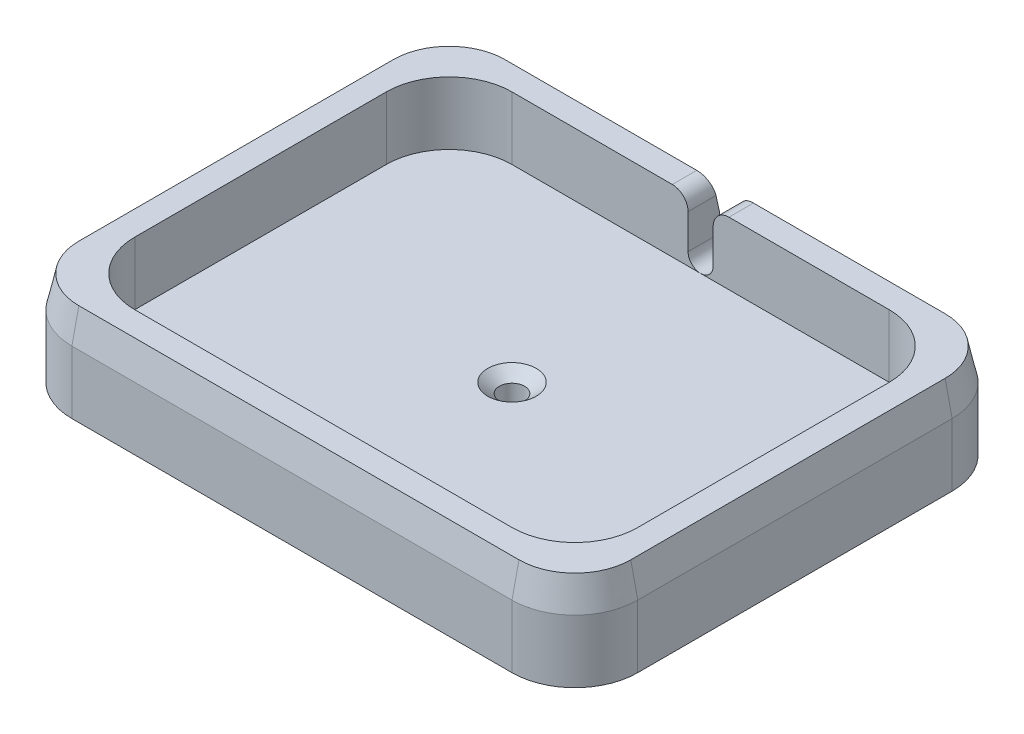
ISO-10303-21;
HEADER;
FILE_DESCRIPTION(('STEP AP214'),'2;1');
FILE_NAME('part.step','',(''),(''),'','','');
FILE_SCHEMA(('AUTOMOTIVE_DESIGN { 1 0 10303 214 1 1 1 1 }'));
ENDSEC;
DATA;
#1=APPLICATION_CONTEXT('core data for automotive mechanical design processes');
#2=APPLICATION_PROTOCOL_DEFINITION('international standard','automotive_design',2000,#1);
#3=PRODUCT_CONTEXT('',#1,'mechanical');
#4=PRODUCT('Part','Part','',(#3));
#5=PRODUCT_RELATED_PRODUCT_CATEGORY('part','',(#4));
#6=PRODUCT_DEFINITION_FORMATION('','',#4);
#7=PRODUCT_DEFINITION_CONTEXT('part definition',#1,'design');
#8=PRODUCT_DEFINITION('design','',#6,#7);
#9=PRODUCT_DEFINITION_SHAPE('','',#8);
#10=(LENGTH_UNIT() NAMED_UNIT(*) SI_UNIT(.MILLI.,.METRE.));
#11=(NAMED_UNIT(*) PLANE_ANGLE_UNIT() SI_UNIT($,.RADIAN.));
#12=(NAMED_UNIT(*) SI_UNIT($,.STERADIAN.) SOLID_ANGLE_UNIT());
#13=UNCERTAINTY_MEASURE_WITH_UNIT(LENGTH_MEASURE(1.E-05),#10,'distance_accuracy_value','');
#14=(GEOMETRIC_REPRESENTATION_CONTEXT(3) GLOBAL_UNCERTAINTY_ASSIGNED_CONTEXT((#13)) GLOBAL_UNIT_ASSIGNED_CONTEXT((#10,
#11,#12)) REPRESENTATION_CONTEXT('',''));
#15=CARTESIAN_POINT('',(0.,0.,0.));
#16=DIRECTION('',(0.,0.,1.));
#17=DIRECTION('',(1.,0.,0.));
#18=AXIS2_PLACEMENT_3D('',#15,#16,#17);
#19=CARTESIAN_POINT('',(0.,0.,0.));
#20=DIRECTION('',(0.,-1.,0.));
#21=DIRECTION('',(0.,0.,-1.));
#22=AXIS2_PLACEMENT_3D('',#19,#20,#21);
#23=PLANE('',#22);
#24=DIRECTION('',(-1.,0.,0.));
#25=VECTOR('',#24,1.);
#26=CARTESIAN_POINT('',(-50.8,0.,-38.1));
#27=LINE('',#26,#25);
#28=CARTESIAN_POINT('',(38.1,0.,-38.1));
#29=VERTEX_POINT('',#28);
#30=CARTESIAN_POINT('',(0.,0.,-38.1));
#31=VERTEX_POINT('',#30);
#32=EDGE_CURVE('E281',#29,#31,#27,.T.);
#33=ORIENTED_EDGE('',*,*,#32,.T.);
#34=CARTESIAN_POINT('',(-38.1,0.,-38.1));
#35=VERTEX_POINT('',#34);
#36=EDGE_CURVE('E280',#31,#35,#27,.T.);
#37=ORIENTED_EDGE('',*,*,#36,.T.);
#38=CARTESIAN_POINT('',(-38.1,0.,-25.4));
#39=DIRECTION('',(0.,-1.,0.));
#40=DIRECTION('',(0.,0.,-1.));
#41=AXIS2_PLACEMENT_3D('',#38,#39,#40);
#42=CIRCLE('',#41,12.7);
#43=CARTESIAN_POINT('',(-50.8,0.,-25.4));
#44=VERTEX_POINT('',#43);
#45=EDGE_CURVE('E299',#35,#44,#42,.F.);
#46=ORIENTED_EDGE('',*,*,#45,.T.);
#47=DIRECTION('',(0.,0.,1.));
#48=VECTOR('',#47,1.);
#49=CARTESIAN_POINT('',(-50.8,0.,38.1));
#50=LINE('',#49,#48);
#51=CARTESIAN_POINT('',(-50.8,0.,25.4));
#52=VERTEX_POINT('',#51);
#53=EDGE_CURVE('E284',#44,#52,#50,.T.);
#54=ORIENTED_EDGE('',*,*,#53,.T.);
#55=CARTESIAN_POINT('',(-38.1,0.,25.4));
#56=DIRECTION('',(0.,-1.,0.));
#57=DIRECTION('',(0.,0.,-1.));
#58=AXIS2_PLACEMENT_3D('',#55,#56,#57);
#59=CIRCLE('',#58,12.7);
#60=CARTESIAN_POINT('',(-38.1,0.,38.1));
#61=VERTEX_POINT('',#60);
#62=EDGE_CURVE('E297',#52,#61,#59,.F.);
#63=ORIENTED_EDGE('',*,*,#62,.T.);
#64=DIRECTION('',(1.,0.,0.));
#65=VECTOR('',#64,1.);
#66=CARTESIAN_POINT('',(-50.8,0.,38.1));
#67=LINE('',#66,#65);
#68=CARTESIAN_POINT('',(38.1,0.,38.1));
#69=VERTEX_POINT('',#68);
#70=EDGE_CURVE('E268',#61,#69,#67,.T.);
#71=ORIENTED_EDGE('',*,*,#70,.T.);
#72=CARTESIAN_POINT('',(38.1,0.,25.4));
#73=DIRECTION('',(0.,-1.,0.));
#74=DIRECTION('',(0.,0.,-1.));
#75=AXIS2_PLACEMENT_3D('',#72,#73,#74);
#76=CIRCLE('',#75,12.7);
#77=CARTESIAN_POINT('',(50.8,0.,25.4));
#78=VERTEX_POINT('',#77);
#79=EDGE_CURVE('E295',#69,#78,#76,.F.);
#80=ORIENTED_EDGE('',*,*,#79,.T.);
#81=DIRECTION('',(0.,0.,-1.));
#82=VECTOR('',#81,1.);
#83=CARTESIAN_POINT('',(50.8,0.,38.1));
#84=LINE('',#83,#82);
#85=CARTESIAN_POINT('',(50.8,0.,-25.4));
#86=VERTEX_POINT('',#85);
#87=EDGE_CURVE('E263',#78,#86,#84,.T.);
#88=ORIENTED_EDGE('',*,*,#87,.T.);
#89=CARTESIAN_POINT('',(38.1,0.,-25.4));
#90=DIRECTION('',(0.,-1.,0.));
#91=DIRECTION('',(0.,0.,-1.));
#92=AXIS2_PLACEMENT_3D('',#89,#90,#91);
#93=CIRCLE('',#92,12.7);
#94=EDGE_CURVE('E293',#86,#29,#93,.F.);
#95=ORIENTED_EDGE('',*,*,#94,.T.);
#96=EDGE_LOOP('',(#33,#37,#46,#54,#63,#71,#80,#88,#95));
#97=FACE_BOUND('',#96,.T.);
#98=CARTESIAN_POINT('',(0.,0.,0.));
#99=DIRECTION('',(0.,1.,0.));
#100=DIRECTION('',(0.,0.,1.));
#101=AXIS2_PLACEMENT_3D('',#98,#99,#100);
#102=CIRCLE('',#101,4.8895);
#103=CARTESIAN_POINT('',(0.,0.,4.8895));
#104=VERTEX_POINT('',#103);
#105=EDGE_CURVE('E428',#104,#104,#102,.T.);
#106=ORIENTED_EDGE('',*,*,#105,.F.);
#107=EDGE_LOOP('',(#106));
#108=FACE_BOUND('',#107,.T.);
#109=ADVANCED_FACE('F32',(#97,#108),#23,.F.);
#110=CARTESIAN_POINT('',(-50.8,12.7,-38.1));
#111=DIRECTION('',(0.,0.,1.));
#112=DIRECTION('',(1.,0.,0.));
#113=AXIS2_PLACEMENT_3D('',#110,#111,#112);
#114=PLANE('',#113);
#115=DIRECTION('',(-1.,0.,0.));
#116=VECTOR('',#115,1.);
#117=CARTESIAN_POINT('',(-50.8,12.7,-38.1));
#118=LINE('',#117,#116);
#119=CARTESIAN_POINT('',(38.1,12.7,-38.1));
#120=VERTEX_POINT('',#119);
#121=CARTESIAN_POINT('',(5.715,12.7,-38.1));
#122=VERTEX_POINT('',#121);
#123=EDGE_CURVE('E269',#120,#122,#118,.T.);
#124=ORIENTED_EDGE('',*,*,#123,.T.);
#125=CARTESIAN_POINT('',(5.715,9.525,-38.1));
#126=DIRECTION('',(0.,0.,1.));
#127=DIRECTION('',(1.,0.,0.));
#128=AXIS2_PLACEMENT_3D('',#125,#126,#127);
#129=CIRCLE('',#128,3.175);
#130=CARTESIAN_POINT('',(2.54,9.525,-38.1));
#131=VERTEX_POINT('',#130);
#132=EDGE_CURVE('E223',#122,#131,#129,.T.);
#133=ORIENTED_EDGE('',*,*,#132,.T.);
#134=DIRECTION('',(0.,-1.,0.));
#135=VECTOR('',#134,1.);
#136=CARTESIAN_POINT('',(2.54,22.86,-38.1));
#137=LINE('',#136,#135);
#138=CARTESIAN_POINT('',(2.54,2.54,-38.1));
#139=VERTEX_POINT('',#138);
#140=EDGE_CURVE('E215',#131,#139,#137,.T.);
#141=ORIENTED_EDGE('',*,*,#140,.T.);
#142=CARTESIAN_POINT('',(0.,2.54,-38.1));
#143=DIRECTION('',(0.,0.,1.));
#144=DIRECTION('',(1.,0.,0.));
#145=AXIS2_PLACEMENT_3D('',#142,#143,#144);
#146=CIRCLE('',#145,2.54);
#147=EDGE_CURVE('E220',#139,#31,#146,.F.);
#148=ORIENTED_EDGE('',*,*,#147,.T.);
#149=ORIENTED_EDGE('',*,*,#32,.F.);
#150=DIRECTION('',(0.,-1.,0.));
#151=VECTOR('',#150,1.);
#152=CARTESIAN_POINT('',(38.1,12.7,-38.1));
#153=LINE('',#152,#151);
#154=EDGE_CURVE('E277',#29,#120,#153,.F.);
#155=ORIENTED_EDGE('',*,*,#154,.T.);
#156=EDGE_LOOP('',(#124,#133,#141,#148,#149,#155));
#157=FACE_BOUND('',#156,.T.);
#158=ADVANCED_FACE('F218',(#157),#114,.T.);
#159=CARTESIAN_POINT('',(0.,12.7,0.));
#160=DIRECTION('',(0.,1.,0.));
#161=DIRECTION('',(0.,0.,1.));
#162=AXIS2_PLACEMENT_3D('',#159,#160,#161);
#163=PLANE('',#162);
#164=DIRECTION('',(0.,0.,-1.));
#165=VECTOR('',#164,1.);
#166=CARTESIAN_POINT('',(-5.715,12.7,-44.45));
#167=LINE('',#166,#165);
#168=CARTESIAN_POINT('',(-5.71500000000001,12.7,-38.1));
#169=VERTEX_POINT('',#168);
#170=CARTESIAN_POINT('',(-5.715,12.7,-43.0422388922173));
#171=VERTEX_POINT('',#170);
#172=EDGE_CURVE('E354',#169,#171,#167,.T.);
#173=ORIENTED_EDGE('',*,*,#172,.T.);
#174=DIRECTION('',(-1.,0.,0.));
#175=VECTOR('',#174,1.);
#176=CARTESIAN_POINT('',(-44.45,12.7,-43.0422388922173));
#177=LINE('',#176,#175);
#178=CARTESIAN_POINT('',(-44.45,12.7,-43.0422388922173));
#179=VERTEX_POINT('',#178);
#180=EDGE_CURVE('E381',#171,#179,#177,.T.);
#181=ORIENTED_EDGE('',*,*,#180,.T.);
#182=CARTESIAN_POINT('',(-44.45,12.7,-31.75));
#183=DIRECTION('',(0.,1.,0.));
#184=DIRECTION('',(0.,0.,1.));
#185=AXIS2_PLACEMENT_3D('',#182,#183,#184);
#186=CIRCLE('',#185,11.2922388922173);
#187=CARTESIAN_POINT('',(-55.7422388922173,12.7,-31.75));
#188=VERTEX_POINT('',#187);
#189=EDGE_CURVE('E379',#179,#188,#186,.T.);
#190=ORIENTED_EDGE('',*,*,#189,.T.);
#191=DIRECTION('',(0.,0.,1.));
#192=VECTOR('',#191,1.);
#193=CARTESIAN_POINT('',(-55.7422388922173,12.7,31.75));
#194=LINE('',#193,#192);
#195=CARTESIAN_POINT('',(-55.7422388922173,12.7,31.75));
#196=VERTEX_POINT('',#195);
#197=EDGE_CURVE('E376',#188,#196,#194,.T.);
#198=ORIENTED_EDGE('',*,*,#197,.T.);
#199=CARTESIAN_POINT('',(-44.45,12.7,31.75));
#200=DIRECTION('',(0.,1.,0.));
#201=DIRECTION('',(0.,0.,1.));
#202=AXIS2_PLACEMENT_3D('',#199,#200,#201);
#203=CIRCLE('',#202,11.2922388922173);
#204=CARTESIAN_POINT('',(-44.45,12.7,43.0422388922173));
#205=VERTEX_POINT('',#204);
#206=EDGE_CURVE('E372',#196,#205,#203,.T.);
#207=ORIENTED_EDGE('',*,*,#206,.T.);
#208=DIRECTION('',(1.,0.,0.));
#209=VECTOR('',#208,1.);
#210=CARTESIAN_POINT('',(44.45,12.7,43.0422388922173));
#211=LINE('',#210,#209);
#212=CARTESIAN_POINT('',(44.45,12.7,43.0422388922173));
#213=VERTEX_POINT('',#212);
#214=EDGE_CURVE('E370',#205,#213,#211,.T.);
#215=ORIENTED_EDGE('',*,*,#214,.T.);
#216=CARTESIAN_POINT('',(44.45,12.7,31.75));
#217=DIRECTION('',(0.,1.,0.));
#218=DIRECTION('',(0.,0.,1.));
#219=AXIS2_PLACEMENT_3D('',#216,#217,#218);
#220=CIRCLE('',#219,11.2922388922173);
#221=CARTESIAN_POINT('',(55.7422388922173,12.7,31.75));
#222=VERTEX_POINT('',#221);
#223=EDGE_CURVE('E368',#213,#222,#220,.T.);
#224=ORIENTED_EDGE('',*,*,#223,.T.);
#225=DIRECTION('',(0.,0.,-1.));
#226=VECTOR('',#225,1.);
#227=CARTESIAN_POINT('',(55.7422388922173,12.7,-31.75));
#228=LINE('',#227,#226);
#229=CARTESIAN_POINT('',(55.7422388922173,12.7,-31.75));
#230=VERTEX_POINT('',#229);
#231=EDGE_CURVE('E364',#222,#230,#228,.T.);
#232=ORIENTED_EDGE('',*,*,#231,.T.);
#233=CARTESIAN_POINT('',(44.45,12.7,-31.75));
#234=DIRECTION('',(0.,1.,0.));
#235=DIRECTION('',(0.,0.,1.));
#236=AXIS2_PLACEMENT_3D('',#233,#234,#235);
#237=CIRCLE('',#236,11.2922388922173);
#238=CARTESIAN_POINT('',(44.45,12.7,-43.0422388922173));
#239=VERTEX_POINT('',#238);
#240=EDGE_CURVE('E366',#230,#239,#237,.T.);
#241=ORIENTED_EDGE('',*,*,#240,.T.);
#242=DIRECTION('',(-1.,0.,0.));
#243=VECTOR('',#242,1.);
#244=CARTESIAN_POINT('',(5.71499999999999,12.7,-43.0422388922173));
#245=LINE('',#244,#243);
#246=CARTESIAN_POINT('',(5.715,12.7,-43.0422388922173));
#247=VERTEX_POINT('',#246);
#248=EDGE_CURVE('E374',#239,#247,#245,.T.);
#249=ORIENTED_EDGE('',*,*,#248,.T.);
#250=DIRECTION('',(0.,0.,1.));
#251=VECTOR('',#250,1.);
#252=CARTESIAN_POINT('',(5.715,12.7,-38.1));
#253=LINE('',#252,#251);
#254=EDGE_CURVE('E352',#247,#122,#253,.T.);
#255=ORIENTED_EDGE('',*,*,#254,.T.);
#256=ORIENTED_EDGE('',*,*,#123,.F.);
#257=CARTESIAN_POINT('',(38.1,12.7,-25.4));
#258=DIRECTION('',(0.,1.,0.));
#259=DIRECTION('',(0.,0.,1.));
#260=AXIS2_PLACEMENT_3D('',#257,#258,#259);
#261=CIRCLE('',#260,12.7);
#262=CARTESIAN_POINT('',(50.8,12.7,-25.4));
#263=VERTEX_POINT('',#262);
#264=EDGE_CURVE('E350',#120,#263,#261,.F.);
#265=ORIENTED_EDGE('',*,*,#264,.T.);
#266=DIRECTION('',(0.,0.,-1.));
#267=VECTOR('',#266,1.);
#268=CARTESIAN_POINT('',(50.8,12.7,38.1));
#269=LINE('',#268,#267);
#270=CARTESIAN_POINT('',(50.8,12.7,25.4));
#271=VERTEX_POINT('',#270);
#272=EDGE_CURVE('E264',#271,#263,#269,.T.);
#273=ORIENTED_EDGE('',*,*,#272,.F.);
#274=CARTESIAN_POINT('',(38.1,12.7,25.4));
#275=DIRECTION('',(0.,1.,0.));
#276=DIRECTION('',(0.,0.,1.));
#277=AXIS2_PLACEMENT_3D('',#274,#275,#276);
#278=CIRCLE('',#277,12.7);
#279=CARTESIAN_POINT('',(38.1,12.7,38.1));
#280=VERTEX_POINT('',#279);
#281=EDGE_CURVE('E348',#271,#280,#278,.F.);
#282=ORIENTED_EDGE('',*,*,#281,.T.);
#283=DIRECTION('',(1.,0.,0.));
#284=VECTOR('',#283,1.);
#285=CARTESIAN_POINT('',(-50.8,12.7,38.1));
#286=LINE('',#285,#284);
#287=CARTESIAN_POINT('',(-38.1,12.7,38.1));
#288=VERTEX_POINT('',#287);
#289=EDGE_CURVE('E274',#288,#280,#286,.T.);
#290=ORIENTED_EDGE('',*,*,#289,.F.);
#291=CARTESIAN_POINT('',(-38.1,12.7,25.4));
#292=DIRECTION('',(0.,1.,0.));
#293=DIRECTION('',(0.,0.,1.));
#294=AXIS2_PLACEMENT_3D('',#291,#292,#293);
#295=CIRCLE('',#294,12.7);
#296=CARTESIAN_POINT('',(-50.8,12.7,25.4));
#297=VERTEX_POINT('',#296);
#298=EDGE_CURVE('E346',#288,#297,#295,.F.);
#299=ORIENTED_EDGE('',*,*,#298,.T.);
#300=DIRECTION('',(0.,0.,1.));
#301=VECTOR('',#300,1.);
#302=CARTESIAN_POINT('',(-50.8,12.7,38.1));
#303=LINE('',#302,#301);
#304=CARTESIAN_POINT('',(-50.8,12.7,-25.4));
#305=VERTEX_POINT('',#304);
#306=EDGE_CURVE('E271',#305,#297,#303,.T.);
#307=ORIENTED_EDGE('',*,*,#306,.F.);
#308=CARTESIAN_POINT('',(-38.1,12.7,-25.4));
#309=DIRECTION('',(0.,1.,0.));
#310=DIRECTION('',(0.,0.,1.));
#311=AXIS2_PLACEMENT_3D('',#308,#309,#310);
#312=CIRCLE('',#311,12.7);
#313=CARTESIAN_POINT('',(-38.1,12.7,-38.1));
#314=VERTEX_POINT('',#313);
#315=EDGE_CURVE('E343',#305,#314,#312,.F.);
#316=ORIENTED_EDGE('',*,*,#315,.T.);
#317=EDGE_CURVE('E267',#169,#314,#118,.T.);
#318=ORIENTED_EDGE('',*,*,#317,.F.);
#319=EDGE_LOOP('',(#173,#181,#190,#198,#207,#215,#224,#232,#241,#249,#255,#256,#265,#273,#282,
#290,#299,#307,#316,#318));
#320=FACE_BOUND('',#319,.T.);
#321=ADVANCED_FACE('F465',(#320),#163,.T.);
#322=CARTESIAN_POINT('',(-57.15,12.7,44.45));
#323=DIRECTION('',(0.,0.,-1.));
#324=DIRECTION('',(-1.,0.,0.));
#325=AXIS2_PLACEMENT_3D('',#322,#323,#324);
#326=PLANE('',#325);
#327=DIRECTION('',(0.,-1.,0.));
#328=VECTOR('',#327,1.);
#329=CARTESIAN_POINT('',(44.45,12.7,44.45));
#330=LINE('',#329,#328);
#331=CARTESIAN_POINT('',(44.45,-6.35,44.45));
#332=VERTEX_POINT('',#331);
#333=CARTESIAN_POINT('',(44.45,6.34999999999992,44.45));
#334=VERTEX_POINT('',#333);
#335=EDGE_CURVE('E330',#332,#334,#330,.F.);
#336=ORIENTED_EDGE('',*,*,#335,.T.);
#337=DIRECTION('',(-1.,0.,0.));
#338=VECTOR('',#337,1.);
#339=CARTESIAN_POINT('',(-44.45,6.34999999999992,44.45));
#340=LINE('',#339,#338);
#341=CARTESIAN_POINT('',(-44.45,6.34999999999992,44.45));
#342=VERTEX_POINT('',#341);
#343=EDGE_CURVE('E401',#334,#342,#340,.T.);
#344=ORIENTED_EDGE('',*,*,#343,.T.);
#345=DIRECTION('',(0.,-1.,0.));
#346=VECTOR('',#345,1.);
#347=CARTESIAN_POINT('',(-44.45,12.7,44.45));
#348=LINE('',#347,#346);
#349=CARTESIAN_POINT('',(-44.45,-6.35,44.45));
#350=VERTEX_POINT('',#349);
#351=EDGE_CURVE('E328',#342,#350,#348,.T.);
#352=ORIENTED_EDGE('',*,*,#351,.T.);
#353=DIRECTION('',(-1.,0.,0.));
#354=VECTOR('',#353,1.);
#355=CARTESIAN_POINT('',(-57.15,-6.35,44.45));
#356=LINE('',#355,#354);
#357=EDGE_CURVE('E260',#332,#350,#356,.T.);
#358=ORIENTED_EDGE('',*,*,#357,.F.);
#359=EDGE_LOOP('',(#336,#344,#352,#358));
#360=FACE_BOUND('',#359,.T.);
#361=ADVANCED_FACE('F533',(#360),#326,.F.);
#362=CARTESIAN_POINT('',(57.15,12.7,44.45));
#363=DIRECTION('',(-1.,0.,0.));
#364=DIRECTION('',(0.,0.,1.));
#365=AXIS2_PLACEMENT_3D('',#362,#363,#364);
#366=PLANE('',#365);
#367=DIRECTION('',(0.,-1.,0.));
#368=VECTOR('',#367,1.);
#369=CARTESIAN_POINT('',(57.15,12.7,-31.75));
#370=LINE('',#369,#368);
#371=CARTESIAN_POINT('',(57.15,-6.35,-31.75));
#372=VERTEX_POINT('',#371);
#373=CARTESIAN_POINT('',(57.15,6.34999999999992,-31.75));
#374=VERTEX_POINT('',#373);
#375=EDGE_CURVE('E316',#372,#374,#370,.F.);
#376=ORIENTED_EDGE('',*,*,#375,.T.);
#377=DIRECTION('',(0.,0.,1.));
#378=VECTOR('',#377,1.);
#379=CARTESIAN_POINT('',(57.15,6.34999999999992,31.75));
#380=LINE('',#379,#378);
#381=CARTESIAN_POINT('',(57.15,6.34999999999992,31.75));
#382=VERTEX_POINT('',#381);
#383=EDGE_CURVE('E11',#374,#382,#380,.T.);
#384=ORIENTED_EDGE('',*,*,#383,.T.);
#385=DIRECTION('',(0.,-1.,0.));
#386=VECTOR('',#385,1.);
#387=CARTESIAN_POINT('',(57.15,12.7,31.75));
#388=LINE('',#387,#386);
#389=CARTESIAN_POINT('',(57.15,-6.35,31.75));
#390=VERTEX_POINT('',#389);
#391=EDGE_CURVE('E318',#382,#390,#388,.T.);
#392=ORIENTED_EDGE('',*,*,#391,.T.);
#393=DIRECTION('',(0.,0.,1.));
#394=VECTOR('',#393,1.);
#395=CARTESIAN_POINT('',(57.15,-6.35,44.45));
#396=LINE('',#395,#394);
#397=EDGE_CURVE('E257',#372,#390,#396,.T.);
#398=ORIENTED_EDGE('',*,*,#397,.F.);
#399=EDGE_LOOP('',(#376,#384,#392,#398));
#400=FACE_BOUND('',#399,.T.);
#401=ADVANCED_FACE('F539',(#400),#366,.F.);
#402=CARTESIAN_POINT('',(-57.15,12.7,-44.45));
#403=DIRECTION('',(0.,0.,1.));
#404=DIRECTION('',(1.,0.,0.));
#405=AXIS2_PLACEMENT_3D('',#402,#403,#404);
#406=PLANE('',#405);
#407=DIRECTION('',(0.,-1.,0.));
#408=VECTOR('',#407,1.);
#409=CARTESIAN_POINT('',(-44.45,12.7,-44.45));
#410=LINE('',#409,#408);
#411=CARTESIAN_POINT('',(-44.45,-6.35,-44.45));
#412=VERTEX_POINT('',#411);
#413=CARTESIAN_POINT('',(-44.45,6.34999999999989,-44.45));
#414=VERTEX_POINT('',#413);
#415=EDGE_CURVE('E340',#412,#414,#410,.F.);
#416=ORIENTED_EDGE('',*,*,#415,.T.);
#417=DIRECTION('',(1.,0.,0.));
#418=VECTOR('',#417,1.);
#419=CARTESIAN_POINT('',(-5.71500000000001,6.34999999999989,-44.45));
#420=LINE('',#419,#418);
#421=CARTESIAN_POINT('',(-2.54,6.34999999999994,-44.45));
#422=VERTEX_POINT('',#421);
#423=EDGE_CURVE('E389',#414,#422,#420,.T.);
#424=ORIENTED_EDGE('',*,*,#423,.T.);
#425=DIRECTION('',(0.,1.,0.));
#426=VECTOR('',#425,1.);
#427=CARTESIAN_POINT('',(-2.54,22.86,-44.45));
#428=LINE('',#427,#426);
#429=CARTESIAN_POINT('',(-2.54,2.54,-44.45));
#430=VERTEX_POINT('',#429);
#431=EDGE_CURVE('E245',#430,#422,#428,.T.);
#432=ORIENTED_EDGE('',*,*,#431,.F.);
#433=CARTESIAN_POINT('',(0.,2.54,-44.45));
#434=DIRECTION('',(0.,0.,-1.));
#435=DIRECTION('',(-1.,0.,0.));
#436=AXIS2_PLACEMENT_3D('',#433,#434,#435);
#437=CIRCLE('',#436,2.54);
#438=CARTESIAN_POINT('',(2.54,2.54,-44.45));
#439=VERTEX_POINT('',#438);
#440=EDGE_CURVE('E249',#439,#430,#437,.T.);
#441=ORIENTED_EDGE('',*,*,#440,.F.);
#442=DIRECTION('',(0.,-1.,0.));
#443=VECTOR('',#442,1.);
#444=CARTESIAN_POINT('',(2.54,22.86,-44.45));
#445=LINE('',#444,#443);
#446=CARTESIAN_POINT('',(2.54,6.34999999999992,-44.45));
#447=VERTEX_POINT('',#446);
#448=EDGE_CURVE('E244',#447,#439,#445,.T.);
#449=ORIENTED_EDGE('',*,*,#448,.F.);
#450=DIRECTION('',(1.,0.,0.));
#451=VECTOR('',#450,1.);
#452=CARTESIAN_POINT('',(44.45,6.34999999999992,-44.45));
#453=LINE('',#452,#451);
#454=CARTESIAN_POINT('',(44.45,6.34999999999992,-44.45));
#455=VERTEX_POINT('',#454);
#456=EDGE_CURVE('E387',#447,#455,#453,.T.);
#457=ORIENTED_EDGE('',*,*,#456,.T.);
#458=DIRECTION('',(0.,-1.,0.));
#459=VECTOR('',#458,1.);
#460=CARTESIAN_POINT('',(44.45,12.7,-44.45));
#461=LINE('',#460,#459);
#462=CARTESIAN_POINT('',(44.45,-6.35,-44.45));
#463=VERTEX_POINT('',#462);
#464=EDGE_CURVE('E338',#455,#463,#461,.T.);
#465=ORIENTED_EDGE('',*,*,#464,.T.);
#466=DIRECTION('',(1.,0.,0.));
#467=VECTOR('',#466,1.);
#468=CARTESIAN_POINT('',(-57.15,-6.35,-44.45));
#469=LINE('',#468,#467);
#470=EDGE_CURVE('E254',#412,#463,#469,.T.);
#471=ORIENTED_EDGE('',*,*,#470,.F.);
#472=EDGE_LOOP('',(#416,#424,#432,#441,#449,#457,#465,#471));
#473=FACE_BOUND('',#472,.T.);
#474=ADVANCED_FACE('F448',(#473),#406,.F.);
#475=CARTESIAN_POINT('',(-57.15,12.7,44.45));
#476=DIRECTION('',(1.,0.,0.));
#477=DIRECTION('',(0.,0.,-1.));
#478=AXIS2_PLACEMENT_3D('',#475,#476,#477);
#479=PLANE('',#478);
#480=DIRECTION('',(0.,-1.,0.));
#481=VECTOR('',#480,1.);
#482=CARTESIAN_POINT('',(-57.15,12.7,31.75));
#483=LINE('',#482,#481);
#484=CARTESIAN_POINT('',(-57.15,-6.35,31.75));
#485=VERTEX_POINT('',#484);
#486=CARTESIAN_POINT('',(-57.15,6.34999999999992,31.75));
#487=VERTEX_POINT('',#486);
#488=EDGE_CURVE('E335',#485,#487,#483,.F.);
#489=ORIENTED_EDGE('',*,*,#488,.T.);
#490=DIRECTION('',(0.,0.,-1.));
#491=VECTOR('',#490,1.);
#492=CARTESIAN_POINT('',(-57.15,6.34999999999989,-31.75));
#493=LINE('',#492,#491);
#494=CARTESIAN_POINT('',(-57.15,6.34999999999989,-31.75));
#495=VERTEX_POINT('',#494);
#496=EDGE_CURVE('E383',#487,#495,#493,.T.);
#497=ORIENTED_EDGE('',*,*,#496,.T.);
#498=DIRECTION('',(0.,-1.,0.));
#499=VECTOR('',#498,1.);
#500=CARTESIAN_POINT('',(-57.15,12.7,-31.75));
#501=LINE('',#500,#499);
#502=CARTESIAN_POINT('',(-57.15,-6.35,-31.75));
#503=VERTEX_POINT('',#502);
#504=EDGE_CURVE('E333',#495,#503,#501,.T.);
#505=ORIENTED_EDGE('',*,*,#504,.T.);
#506=DIRECTION('',(0.,0.,-1.));
#507=VECTOR('',#506,1.);
#508=CARTESIAN_POINT('',(-57.15,-6.35,44.45));
#509=LINE('',#508,#507);
#510=EDGE_CURVE('E228',#485,#503,#509,.T.);
#511=ORIENTED_EDGE('',*,*,#510,.F.);
#512=EDGE_LOOP('',(#489,#497,#505,#511));
#513=FACE_BOUND('',#512,.T.);
#514=ADVANCED_FACE('F530',(#513),#479,.F.);
#515=CARTESIAN_POINT('',(50.8,12.7,38.1));
#516=DIRECTION('',(-1.,0.,0.));
#517=DIRECTION('',(0.,0.,1.));
#518=AXIS2_PLACEMENT_3D('',#515,#516,#517);
#519=PLANE('',#518);
#520=ORIENTED_EDGE('',*,*,#87,.F.);
#521=DIRECTION('',(0.,-1.,0.));
#522=VECTOR('',#521,1.);
#523=CARTESIAN_POINT('',(50.8,12.7,25.4));
#524=LINE('',#523,#522);
#525=EDGE_CURVE('E314',#78,#271,#524,.F.);
#526=ORIENTED_EDGE('',*,*,#525,.T.);
#527=ORIENTED_EDGE('',*,*,#272,.T.);
#528=DIRECTION('',(0.,-1.,0.));
#529=VECTOR('',#528,1.);
#530=CARTESIAN_POINT('',(50.8,0.,-25.4));
#531=LINE('',#530,#529);
#532=EDGE_CURVE('E311',#263,#86,#531,.T.);
#533=ORIENTED_EDGE('',*,*,#532,.T.);
#534=EDGE_LOOP('',(#520,#526,#527,#533));
#535=FACE_BOUND('',#534,.T.);
#536=ADVANCED_FACE('F484',(#535),#519,.T.);
#537=DIRECTION('',(0.,1.,0.));
#538=VECTOR('',#537,1.);
#539=CARTESIAN_POINT('',(-2.54,22.86,-38.1));
#540=LINE('',#539,#538);
#541=CARTESIAN_POINT('',(-2.54,2.54,-38.1));
#542=VERTEX_POINT('',#541);
#543=CARTESIAN_POINT('',(-2.54,9.525,-38.1));
#544=VERTEX_POINT('',#543);
#545=EDGE_CURVE('E240',#542,#544,#540,.T.);
#546=ORIENTED_EDGE('',*,*,#545,.T.);
#547=CARTESIAN_POINT('',(-5.715,9.525,-38.1));
#548=DIRECTION('',(0.,0.,1.));
#549=DIRECTION('',(1.,0.,0.));
#550=AXIS2_PLACEMENT_3D('',#547,#548,#549);
#551=CIRCLE('',#550,3.175);
#552=EDGE_CURVE('E359',#544,#169,#551,.T.);
#553=ORIENTED_EDGE('',*,*,#552,.T.);
#554=ORIENTED_EDGE('',*,*,#317,.T.);
#555=DIRECTION('',(0.,-1.,0.));
#556=VECTOR('',#555,1.);
#557=CARTESIAN_POINT('',(-38.1,0.,-38.1));
#558=LINE('',#557,#556);
#559=EDGE_CURVE('E290',#314,#35,#558,.T.);
#560=ORIENTED_EDGE('',*,*,#559,.T.);
#561=ORIENTED_EDGE('',*,*,#36,.F.);
#562=EDGE_CURVE('E239',#31,#542,#146,.F.);
#563=ORIENTED_EDGE('',*,*,#562,.T.);
#564=EDGE_LOOP('',(#546,#553,#554,#560,#561,#563));
#565=FACE_BOUND('',#564,.T.);
#566=ADVANCED_FACE('F470',(#565),#114,.T.);
#567=CARTESIAN_POINT('',(-50.8,12.7,38.1));
#568=DIRECTION('',(1.,0.,0.));
#569=DIRECTION('',(0.,0.,-1.));
#570=AXIS2_PLACEMENT_3D('',#567,#568,#569);
#571=PLANE('',#570);
#572=ORIENTED_EDGE('',*,*,#53,.F.);
#573=DIRECTION('',(0.,-1.,0.));
#574=VECTOR('',#573,1.);
#575=CARTESIAN_POINT('',(-50.8,12.7,-25.4));
#576=LINE('',#575,#574);
#577=EDGE_CURVE('E304',#44,#305,#576,.F.);
#578=ORIENTED_EDGE('',*,*,#577,.T.);
#579=ORIENTED_EDGE('',*,*,#306,.T.);
#580=DIRECTION('',(0.,-1.,0.));
#581=VECTOR('',#580,1.);
#582=CARTESIAN_POINT('',(-50.8,0.,25.4));
#583=LINE('',#582,#581);
#584=EDGE_CURVE('E301',#297,#52,#583,.T.);
#585=ORIENTED_EDGE('',*,*,#584,.T.);
#586=EDGE_LOOP('',(#572,#578,#579,#585));
#587=FACE_BOUND('',#586,.T.);
#588=ADVANCED_FACE('F500',(#587),#571,.T.);
#589=CARTESIAN_POINT('',(-50.8,12.7,38.1));
#590=DIRECTION('',(0.,0.,-1.));
#591=DIRECTION('',(-1.,0.,0.));
#592=AXIS2_PLACEMENT_3D('',#589,#590,#591);
#593=PLANE('',#592);
#594=ORIENTED_EDGE('',*,*,#70,.F.);
#595=DIRECTION('',(0.,-1.,0.));
#596=VECTOR('',#595,1.);
#597=CARTESIAN_POINT('',(-38.1,12.7,38.1));
#598=LINE('',#597,#596);
#599=EDGE_CURVE('E309',#61,#288,#598,.F.);
#600=ORIENTED_EDGE('',*,*,#599,.T.);
#601=ORIENTED_EDGE('',*,*,#289,.T.);
#602=DIRECTION('',(0.,-1.,0.));
#603=VECTOR('',#602,1.);
#604=CARTESIAN_POINT('',(38.1,0.,38.1));
#605=LINE('',#604,#603);
#606=EDGE_CURVE('E306',#280,#69,#605,.T.);
#607=ORIENTED_EDGE('',*,*,#606,.T.);
#608=EDGE_LOOP('',(#594,#600,#601,#607));
#609=FACE_BOUND('',#608,.T.);
#610=ADVANCED_FACE('F493',(#609),#593,.T.);
#611=CARTESIAN_POINT('',(0.,-6.35,0.));
#612=DIRECTION('',(0.,-1.,0.));
#613=DIRECTION('',(0.,0.,-1.));
#614=AXIS2_PLACEMENT_3D('',#611,#612,#613);
#615=PLANE('',#614);
#616=CARTESIAN_POINT('',(0.,-6.34999999999999,0.));
#617=DIRECTION('',(0.,1.,0.));
#618=DIRECTION('',(0.,0.,1.));
#619=AXIS2_PLACEMENT_3D('',#616,#617,#618);
#620=CIRCLE('',#619,2.55269999999999);
#621=CARTESIAN_POINT('',(0.,-6.34999999999999,2.55269999999999));
#622=VERTEX_POINT('',#621);
#623=EDGE_CURVE('E438',#622,#622,#620,.T.);
#624=ORIENTED_EDGE('',*,*,#623,.T.);
#625=EDGE_LOOP('',(#624));
#626=FACE_BOUND('',#625,.T.);
#627=ORIENTED_EDGE('',*,*,#397,.T.);
#628=CARTESIAN_POINT('',(44.45,-6.35,31.75));
#629=DIRECTION('',(0.,-1.,0.));
#630=DIRECTION('',(0.,0.,-1.));
#631=AXIS2_PLACEMENT_3D('',#628,#629,#630);
#632=CIRCLE('',#631,12.7);
#633=EDGE_CURVE('E326',#390,#332,#632,.T.);
#634=ORIENTED_EDGE('',*,*,#633,.T.);
#635=ORIENTED_EDGE('',*,*,#357,.T.);
#636=CARTESIAN_POINT('',(-44.45,-6.35,31.75));
#637=DIRECTION('',(0.,-1.,0.));
#638=DIRECTION('',(0.,0.,-1.));
#639=AXIS2_PLACEMENT_3D('',#636,#637,#638);
#640=CIRCLE('',#639,12.7);
#641=EDGE_CURVE('E324',#350,#485,#640,.T.);
#642=ORIENTED_EDGE('',*,*,#641,.T.);
#643=ORIENTED_EDGE('',*,*,#510,.T.);
#644=CARTESIAN_POINT('',(-44.45,-6.35,-31.75));
#645=DIRECTION('',(0.,-1.,0.));
#646=DIRECTION('',(0.,0.,-1.));
#647=AXIS2_PLACEMENT_3D('',#644,#645,#646);
#648=CIRCLE('',#647,12.7);
#649=EDGE_CURVE('E322',#503,#412,#648,.T.);
#650=ORIENTED_EDGE('',*,*,#649,.T.);
#651=ORIENTED_EDGE('',*,*,#470,.T.);
#652=CARTESIAN_POINT('',(44.45,-6.35,-31.75));
#653=DIRECTION('',(0.,-1.,0.));
#654=DIRECTION('',(0.,0.,-1.));
#655=AXIS2_PLACEMENT_3D('',#652,#653,#654);
#656=CIRCLE('',#655,12.7);
#657=EDGE_CURVE('E320',#463,#372,#656,.T.);
#658=ORIENTED_EDGE('',*,*,#657,.T.);
#659=EDGE_LOOP('',(#627,#634,#635,#642,#643,#650,#651,#658));
#660=FACE_BOUND('',#659,.T.);
#661=ADVANCED_FACE('F505',(#626,#660),#615,.T.);
#662=CARTESIAN_POINT('',(-38.1,12.7,-25.4));
#663=DIRECTION('',(0.,1.,0.));
#664=DIRECTION('',(0.,0.,1.));
#665=AXIS2_PLACEMENT_3D('',#662,#663,#664);
#666=CYLINDRICAL_SURFACE('',#665,12.7);
#667=ORIENTED_EDGE('',*,*,#315,.F.);
#668=ORIENTED_EDGE('',*,*,#577,.F.);
#669=ORIENTED_EDGE('',*,*,#45,.F.);
#670=ORIENTED_EDGE('',*,*,#559,.F.);
#671=EDGE_LOOP('',(#667,#668,#669,#670));
#672=FACE_BOUND('',#671,.T.);
#673=ADVANCED_FACE('F503',(#672),#666,.F.);
#674=CARTESIAN_POINT('',(-38.1,12.7,25.4));
#675=DIRECTION('',(0.,1.,0.));
#676=DIRECTION('',(0.,0.,1.));
#677=AXIS2_PLACEMENT_3D('',#674,#675,#676);
#678=CYLINDRICAL_SURFACE('',#677,12.7);
#679=ORIENTED_EDGE('',*,*,#298,.F.);
#680=ORIENTED_EDGE('',*,*,#599,.F.);
#681=ORIENTED_EDGE('',*,*,#62,.F.);
#682=ORIENTED_EDGE('',*,*,#584,.F.);
#683=EDGE_LOOP('',(#679,#680,#681,#682));
#684=FACE_BOUND('',#683,.T.);
#685=ADVANCED_FACE('F496',(#684),#678,.F.);
#686=CARTESIAN_POINT('',(38.1,12.7,25.4));
#687=DIRECTION('',(0.,1.,0.));
#688=DIRECTION('',(0.,0.,1.));
#689=AXIS2_PLACEMENT_3D('',#686,#687,#688);
#690=CYLINDRICAL_SURFACE('',#689,12.7);
#691=ORIENTED_EDGE('',*,*,#281,.F.);
#692=ORIENTED_EDGE('',*,*,#525,.F.);
#693=ORIENTED_EDGE('',*,*,#79,.F.);
#694=ORIENTED_EDGE('',*,*,#606,.F.);
#695=EDGE_LOOP('',(#691,#692,#693,#694));
#696=FACE_BOUND('',#695,.T.);
#697=ADVANCED_FACE('F487',(#696),#690,.F.);
#698=CARTESIAN_POINT('',(38.1,12.7,-25.4));
#699=DIRECTION('',(0.,1.,0.));
#700=DIRECTION('',(0.,0.,1.));
#701=AXIS2_PLACEMENT_3D('',#698,#699,#700);
#702=CYLINDRICAL_SURFACE('',#701,12.7);
#703=ORIENTED_EDGE('',*,*,#264,.F.);
#704=ORIENTED_EDGE('',*,*,#154,.F.);
#705=ORIENTED_EDGE('',*,*,#94,.F.);
#706=ORIENTED_EDGE('',*,*,#532,.F.);
#707=EDGE_LOOP('',(#703,#704,#705,#706));
#708=FACE_BOUND('',#707,.T.);
#709=ADVANCED_FACE('F478',(#708),#702,.F.);
#710=CARTESIAN_POINT('',(44.45,12.7,31.75));
#711=DIRECTION('',(0.,-1.,0.));
#712=DIRECTION('',(0.,0.,-1.));
#713=AXIS2_PLACEMENT_3D('',#710,#711,#712);
#714=CYLINDRICAL_SURFACE('',#713,12.7);
#715=ORIENTED_EDGE('',*,*,#391,.F.);
#716=CARTESIAN_POINT('',(44.45,6.34999999999992,31.75));
#717=DIRECTION('',(0.,1.,0.));
#718=DIRECTION('',(0.,0.,1.));
#719=AXIS2_PLACEMENT_3D('',#716,#717,#718);
#720=CIRCLE('',#719,12.7);
#721=EDGE_CURVE('E403',#382,#334,#720,.F.);
#722=ORIENTED_EDGE('',*,*,#721,.T.);
#723=ORIENTED_EDGE('',*,*,#335,.F.);
#724=ORIENTED_EDGE('',*,*,#633,.F.);
#725=EDGE_LOOP('',(#715,#722,#723,#724));
#726=FACE_BOUND('',#725,.T.);
#727=ADVANCED_FACE('F588',(#726),#714,.T.);
#728=CARTESIAN_POINT('',(-44.45,12.7,31.75));
#729=DIRECTION('',(0.,-1.,0.));
#730=DIRECTION('',(0.,0.,-1.));
#731=AXIS2_PLACEMENT_3D('',#728,#729,#730);
#732=CYLINDRICAL_SURFACE('',#731,12.7);
#733=ORIENTED_EDGE('',*,*,#351,.F.);
#734=CARTESIAN_POINT('',(-44.45,6.34999999999992,31.75));
#735=DIRECTION('',(0.,1.,0.));
#736=DIRECTION('',(0.,0.,1.));
#737=AXIS2_PLACEMENT_3D('',#734,#735,#736);
#738=CIRCLE('',#737,12.7);
#739=EDGE_CURVE('E399',#342,#487,#738,.F.);
#740=ORIENTED_EDGE('',*,*,#739,.T.);
#741=ORIENTED_EDGE('',*,*,#488,.F.);
#742=ORIENTED_EDGE('',*,*,#641,.F.);
#743=EDGE_LOOP('',(#733,#740,#741,#742));
#744=FACE_BOUND('',#743,.T.);
#745=ADVANCED_FACE('F567',(#744),#732,.T.);
#746=CARTESIAN_POINT('',(-44.45,12.7,-31.75));
#747=DIRECTION('',(0.,-1.,0.));
#748=DIRECTION('',(0.,0.,-1.));
#749=AXIS2_PLACEMENT_3D('',#746,#747,#748);
#750=CYLINDRICAL_SURFACE('',#749,12.7);
#751=ORIENTED_EDGE('',*,*,#504,.F.);
#752=CARTESIAN_POINT('',(-44.45,6.34999999999989,-31.75));
#753=DIRECTION('',(0.,1.,0.));
#754=DIRECTION('',(0.,0.,1.));
#755=AXIS2_PLACEMENT_3D('',#752,#753,#754);
#756=CIRCLE('',#755,12.7);
#757=EDGE_CURVE('E385',#495,#414,#756,.F.);
#758=ORIENTED_EDGE('',*,*,#757,.T.);
#759=ORIENTED_EDGE('',*,*,#415,.F.);
#760=ORIENTED_EDGE('',*,*,#649,.F.);
#761=EDGE_LOOP('',(#751,#758,#759,#760));
#762=FACE_BOUND('',#761,.T.);
#763=ADVANCED_FACE('F582',(#762),#750,.T.);
#764=CARTESIAN_POINT('',(44.45,12.7,-31.75));
#765=DIRECTION('',(0.,-1.,0.));
#766=DIRECTION('',(0.,0.,-1.));
#767=AXIS2_PLACEMENT_3D('',#764,#765,#766);
#768=CYLINDRICAL_SURFACE('',#767,12.7);
#769=ORIENTED_EDGE('',*,*,#464,.F.);
#770=CARTESIAN_POINT('',(44.45,6.34999999999992,-31.75));
#771=DIRECTION('',(0.,1.,0.));
#772=DIRECTION('',(0.,0.,1.));
#773=AXIS2_PLACEMENT_3D('',#770,#771,#772);
#774=CIRCLE('',#773,12.7);
#775=EDGE_CURVE('E41',#455,#374,#774,.F.);
#776=ORIENTED_EDGE('',*,*,#775,.T.);
#777=ORIENTED_EDGE('',*,*,#375,.F.);
#778=ORIENTED_EDGE('',*,*,#657,.F.);
#779=EDGE_LOOP('',(#769,#776,#777,#778));
#780=FACE_BOUND('',#779,.T.);
#781=ADVANCED_FACE('F621',(#780),#768,.T.);
#782=CARTESIAN_POINT('',(2.54,22.86,44.451));
#783=DIRECTION('',(1.,0.,0.));
#784=DIRECTION('',(0.,0.,-1.));
#785=AXIS2_PLACEMENT_3D('',#782,#783,#784);
#786=PLANE('',#785);
#787=DIRECTION('',(0.,0.,1.));
#788=VECTOR('',#787,1.);
#789=CARTESIAN_POINT('',(2.54,9.525,-44.45));
#790=LINE('',#789,#788);
#791=CARTESIAN_POINT('',(2.54,9.525,-43.7461194461087));
#792=VERTEX_POINT('',#791);
#793=EDGE_CURVE('E362',#131,#792,#790,.F.);
#794=ORIENTED_EDGE('',*,*,#793,.T.);
#795=DIRECTION('',(0.,-0.976296007119934,-0.2164396139381));
#796=VECTOR('',#795,1.);
#797=CARTESIAN_POINT('',(2.54,12.7,-43.0422388922173));
#798=LINE('',#797,#796);
#799=EDGE_CURVE('E397',#792,#447,#798,.T.);
#800=ORIENTED_EDGE('',*,*,#799,.T.);
#801=ORIENTED_EDGE('',*,*,#448,.T.);
#802=DIRECTION('',(0.,0.,-1.));
#803=VECTOR('',#802,1.);
#804=CARTESIAN_POINT('',(2.54,2.54,44.451));
#805=LINE('',#804,#803);
#806=EDGE_CURVE('E235',#139,#439,#805,.T.);
#807=ORIENTED_EDGE('',*,*,#806,.F.);
#808=ORIENTED_EDGE('',*,*,#140,.F.);
#809=EDGE_LOOP('',(#794,#800,#801,#807,#808));
#810=FACE_BOUND('',#809,.T.);
#811=ADVANCED_FACE('F242',(#810),#786,.F.);
#812=CARTESIAN_POINT('',(0.,2.54,44.451));
#813=DIRECTION('',(0.,0.,-1.));
#814=DIRECTION('',(-1.,0.,0.));
#815=AXIS2_PLACEMENT_3D('',#812,#813,#814);
#816=CYLINDRICAL_SURFACE('',#815,2.54);
#817=ORIENTED_EDGE('',*,*,#806,.T.);
#818=ORIENTED_EDGE('',*,*,#440,.T.);
#819=DIRECTION('',(0.,0.,-1.));
#820=VECTOR('',#819,1.);
#821=CARTESIAN_POINT('',(-2.54,2.54,44.451));
#822=LINE('',#821,#820);
#823=EDGE_CURVE('E229',#542,#430,#822,.T.);
#824=ORIENTED_EDGE('',*,*,#823,.F.);
#825=ORIENTED_EDGE('',*,*,#562,.F.);
#826=ORIENTED_EDGE('',*,*,#147,.F.);
#827=EDGE_LOOP('',(#817,#818,#824,#825,#826));
#828=FACE_BOUND('',#827,.T.);
#829=ADVANCED_FACE('F233',(#828),#816,.F.);
#830=CARTESIAN_POINT('',(-2.54,22.86,44.451));
#831=DIRECTION('',(-1.,0.,0.));
#832=DIRECTION('',(0.,0.,1.));
#833=AXIS2_PLACEMENT_3D('',#830,#831,#832);
#834=PLANE('',#833);
#835=ORIENTED_EDGE('',*,*,#431,.T.);
#836=DIRECTION('',(0.,0.976296007119934,0.216439613938101));
#837=VECTOR('',#836,1.);
#838=CARTESIAN_POINT('',(-2.54,12.7,-43.0422388922173));
#839=LINE('',#838,#837);
#840=CARTESIAN_POINT('',(-2.54,9.525,-43.7461194461087));
#841=VERTEX_POINT('',#840);
#842=EDGE_CURVE('E391',#422,#841,#839,.T.);
#843=ORIENTED_EDGE('',*,*,#842,.T.);
#844=DIRECTION('',(0.,0.,-1.));
#845=VECTOR('',#844,1.);
#846=CARTESIAN_POINT('',(-2.54,9.525,-38.1));
#847=LINE('',#846,#845);
#848=EDGE_CURVE('E357',#841,#544,#847,.F.);
#849=ORIENTED_EDGE('',*,*,#848,.T.);
#850=ORIENTED_EDGE('',*,*,#545,.F.);
#851=ORIENTED_EDGE('',*,*,#823,.T.);
#852=EDGE_LOOP('',(#835,#843,#849,#850,#851));
#853=FACE_BOUND('',#852,.T.);
#854=ADVANCED_FACE('F452',(#853),#834,.F.);
#855=CARTESIAN_POINT('',(-5.715,9.525,0.));
#856=DIRECTION('',(0.,0.,1.));
#857=DIRECTION('',(1.,0.,0.));
#858=AXIS2_PLACEMENT_3D('',#855,#856,#857);
#859=CYLINDRICAL_SURFACE('',#858,3.175);
#860=ORIENTED_EDGE('',*,*,#848,.F.);
#861=CARTESIAN_POINT('',(-5.715,9.525,-43.7461194461087));
#862=DIRECTION('',(0.,0.216439613938101,-0.976296007119934));
#863=DIRECTION('',(0.,0.976296007119934,0.216439613938101));
#864=AXIS2_PLACEMENT_3D('',#861,#862,#863);
#865=ELLIPSE('',#864,3.25208745794856,3.175);
#866=EDGE_CURVE('E393',#841,#171,#865,.F.);
#867=ORIENTED_EDGE('',*,*,#866,.T.);
#868=ORIENTED_EDGE('',*,*,#172,.F.);
#869=ORIENTED_EDGE('',*,*,#552,.F.);
#870=EDGE_LOOP('',(#860,#867,#868,#869));
#871=FACE_BOUND('',#870,.T.);
#872=ADVANCED_FACE('F461',(#871),#859,.T.);
#873=CARTESIAN_POINT('',(5.715,9.525,0.));
#874=DIRECTION('',(0.,0.,-1.));
#875=DIRECTION('',(-1.,0.,0.));
#876=AXIS2_PLACEMENT_3D('',#873,#874,#875);
#877=CYLINDRICAL_SURFACE('',#876,3.175);
#878=ORIENTED_EDGE('',*,*,#254,.F.);
#879=CARTESIAN_POINT('',(5.715,9.525,-43.7461194461087));
#880=DIRECTION('',(0.,0.2164396139381,-0.976296007119934));
#881=DIRECTION('',(0.,-0.976296007119934,-0.2164396139381));
#882=AXIS2_PLACEMENT_3D('',#879,#880,#881);
#883=ELLIPSE('',#882,3.25208745794856,3.175);
#884=EDGE_CURVE('E395',#247,#792,#883,.F.);
#885=ORIENTED_EDGE('',*,*,#884,.T.);
#886=ORIENTED_EDGE('',*,*,#793,.F.);
#887=ORIENTED_EDGE('',*,*,#132,.F.);
#888=EDGE_LOOP('',(#878,#885,#886,#887));
#889=FACE_BOUND('',#888,.T.);
#890=ADVANCED_FACE('F614',(#889),#877,.T.);
#891=CARTESIAN_POINT('',(0.,0.,0.));
#892=DIRECTION('',(0.,1.,0.));
#893=DIRECTION('',(0.,0.,1.));
#894=AXIS2_PLACEMENT_3D('',#891,#892,#893);
#895=CYLINDRICAL_SURFACE('',#894,2.55269999999999);
#896=ORIENTED_EDGE('',*,*,#623,.F.);
#897=EDGE_LOOP('',(#896));
#898=FACE_BOUND('',#897,.T.);
#899=CARTESIAN_POINT('',(0.,-1.96080801813507,0.));
#900=DIRECTION('',(0.,1.,0.));
#901=DIRECTION('',(0.,0.,1.));
#902=AXIS2_PLACEMENT_3D('',#899,#900,#901);
#903=CIRCLE('',#902,2.55269999999999);
#904=CARTESIAN_POINT('',(0.,-1.96080801813507,2.55269999999999));
#905=VERTEX_POINT('',#904);
#906=EDGE_CURVE('E433',#905,#905,#903,.T.);
#907=ORIENTED_EDGE('',*,*,#906,.T.);
#908=EDGE_LOOP('',(#907));
#909=FACE_BOUND('',#908,.T.);
#910=ADVANCED_FACE('F617',(#898,#909),#895,.F.);
#911=CARTESIAN_POINT('',(0.,0.,0.));
#912=DIRECTION('',(0.,1.,0.));
#913=DIRECTION('',(0.,0.,1.));
#914=AXIS2_PLACEMENT_3D('',#911,#912,#913);
#915=CONICAL_SURFACE('',#914,4.8895,0.872664625997166);
#916=ORIENTED_EDGE('',*,*,#906,.F.);
#917=EDGE_LOOP('',(#916));
#918=FACE_BOUND('',#917,.T.);
#919=ORIENTED_EDGE('',*,*,#105,.T.);
#920=EDGE_LOOP('',(#919));
#921=FACE_BOUND('',#920,.T.);
#922=ADVANCED_FACE('F599',(#918,#921),#915,.F.);
#923=CARTESIAN_POINT('',(0.,12.7,-43.0422388922173));
#924=DIRECTION('',(0.,0.2164396139381,-0.976296007119934));
#925=DIRECTION('',(1.,0.,0.));
#926=AXIS2_PLACEMENT_3D('',#923,#924,#925);
#927=PLANE('',#926);
#928=ORIENTED_EDGE('',*,*,#884,.F.);
#929=ORIENTED_EDGE('',*,*,#248,.F.);
#930=DIRECTION('',(0.,0.976296007119934,0.216439613938101));
#931=VECTOR('',#930,1.);
#932=CARTESIAN_POINT('',(44.45,6.34999999999992,-44.45));
#933=LINE('',#932,#931);
#934=EDGE_CURVE('E36',#455,#239,#933,.T.);
#935=ORIENTED_EDGE('',*,*,#934,.F.);
#936=ORIENTED_EDGE('',*,*,#456,.F.);
#937=ORIENTED_EDGE('',*,*,#799,.F.);
#938=EDGE_LOOP('',(#928,#929,#935,#936,#937));
#939=FACE_BOUND('',#938,.T.);
#940=ADVANCED_FACE('F34',(#939),#927,.T.);
#941=CARTESIAN_POINT('',(44.45,12.7,-31.75));
#942=DIRECTION('',(0.,-1.,0.));
#943=DIRECTION('',(0.,0.,-1.));
#944=AXIS2_PLACEMENT_3D('',#941,#942,#943);
#945=CONICAL_SURFACE('',#944,11.2922388922173,0.218166156499289);
#946=ORIENTED_EDGE('',*,*,#934,.T.);
#947=ORIENTED_EDGE('',*,*,#240,.F.);
#948=DIRECTION('',(-0.216439613938101,0.976296007119934,0.));
#949=VECTOR('',#948,1.);
#950=CARTESIAN_POINT('',(57.15,6.34999999999992,-31.75));
#951=LINE('',#950,#949);
#952=EDGE_CURVE('E422',#374,#230,#951,.T.);
#953=ORIENTED_EDGE('',*,*,#952,.F.);
#954=ORIENTED_EDGE('',*,*,#775,.F.);
#955=EDGE_LOOP('',(#946,#947,#953,#954));
#956=FACE_BOUND('',#955,.T.);
#957=ADVANCED_FACE('F592',(#956),#945,.T.);
#958=CARTESIAN_POINT('',(55.7422388922173,12.7,0.));
#959=DIRECTION('',(0.976296007119934,0.2164396139381,0.));
#960=DIRECTION('',(0.,0.,1.));
#961=AXIS2_PLACEMENT_3D('',#958,#959,#960);
#962=PLANE('',#961);
#963=ORIENTED_EDGE('',*,*,#952,.T.);
#964=ORIENTED_EDGE('',*,*,#231,.F.);
#965=DIRECTION('',(-0.216439613938101,0.976296007119934,0.));
#966=VECTOR('',#965,1.);
#967=CARTESIAN_POINT('',(57.15,6.34999999999992,31.75));
#968=LINE('',#967,#966);
#969=EDGE_CURVE('E420',#382,#222,#968,.T.);
#970=ORIENTED_EDGE('',*,*,#969,.F.);
#971=ORIENTED_EDGE('',*,*,#383,.F.);
#972=EDGE_LOOP('',(#963,#964,#970,#971));
#973=FACE_BOUND('',#972,.T.);
#974=ADVANCED_FACE('F590',(#973),#962,.T.);
#975=CARTESIAN_POINT('',(44.45,12.7,31.75));
#976=DIRECTION('',(0.,-1.,0.));
#977=DIRECTION('',(0.,0.,-1.));
#978=AXIS2_PLACEMENT_3D('',#975,#976,#977);
#979=CONICAL_SURFACE('',#978,11.2922388922173,0.21816615649929);
#980=ORIENTED_EDGE('',*,*,#969,.T.);
#981=ORIENTED_EDGE('',*,*,#223,.F.);
#982=DIRECTION('',(0.,0.976296007119934,-0.216439613938101));
#983=VECTOR('',#982,1.);
#984=CARTESIAN_POINT('',(44.45,6.34999999999992,44.45));
#985=LINE('',#984,#983);
#986=EDGE_CURVE('E417',#334,#213,#985,.T.);
#987=ORIENTED_EDGE('',*,*,#986,.F.);
#988=ORIENTED_EDGE('',*,*,#721,.F.);
#989=EDGE_LOOP('',(#980,#981,#987,#988));
#990=FACE_BOUND('',#989,.T.);
#991=ADVANCED_FACE('F555',(#990),#979,.T.);
#992=CARTESIAN_POINT('',(0.,12.7,-43.0422388922173));
#993=DIRECTION('',(0.,0.216439613938101,-0.976296007119934));
#994=DIRECTION('',(1.,0.,0.));
#995=AXIS2_PLACEMENT_3D('',#992,#993,#994);
#996=PLANE('',#995);
#997=ORIENTED_EDGE('',*,*,#842,.F.);
#998=ORIENTED_EDGE('',*,*,#423,.F.);
#999=DIRECTION('',(0.,-0.976296007119934,-0.2164396139381));
#1000=VECTOR('',#999,1.);
#1001=CARTESIAN_POINT('',(-44.45,12.7,-43.0422388922173));
#1002=LINE('',#1001,#1000);
#1003=EDGE_CURVE('E414',#179,#414,#1002,.T.);
#1004=ORIENTED_EDGE('',*,*,#1003,.F.);
#1005=ORIENTED_EDGE('',*,*,#180,.F.);
#1006=ORIENTED_EDGE('',*,*,#866,.F.);
#1007=EDGE_LOOP('',(#997,#998,#1004,#1005,#1006));
#1008=FACE_BOUND('',#1007,.T.);
#1009=ADVANCED_FACE('F456',(#1008),#996,.T.);
#1010=CARTESIAN_POINT('',(0.,12.7,43.0422388922173));
#1011=DIRECTION('',(0.,0.216439613938101,0.976296007119934));
#1012=DIRECTION('',(-1.,0.,0.));
#1013=AXIS2_PLACEMENT_3D('',#1010,#1011,#1012);
#1014=PLANE('',#1013);
#1015=ORIENTED_EDGE('',*,*,#986,.T.);
#1016=ORIENTED_EDGE('',*,*,#214,.F.);
#1017=DIRECTION('',(0.,0.976296007119934,-0.216439613938101));
#1018=VECTOR('',#1017,1.);
#1019=CARTESIAN_POINT('',(-44.45,6.34999999999992,44.45));
#1020=LINE('',#1019,#1018);
#1021=EDGE_CURVE('E411',#342,#205,#1020,.T.);
#1022=ORIENTED_EDGE('',*,*,#1021,.F.);
#1023=ORIENTED_EDGE('',*,*,#343,.F.);
#1024=EDGE_LOOP('',(#1015,#1016,#1022,#1023));
#1025=FACE_BOUND('',#1024,.T.);
#1026=ADVANCED_FACE('F559',(#1025),#1014,.T.);
#1027=CARTESIAN_POINT('',(-44.45,12.7,-31.75));
#1028=DIRECTION('',(0.,-1.,0.));
#1029=DIRECTION('',(0.,0.,-1.));
#1030=AXIS2_PLACEMENT_3D('',#1027,#1028,#1029);
#1031=CONICAL_SURFACE('',#1030,11.2922388922173,0.21816615649929);
#1032=ORIENTED_EDGE('',*,*,#1003,.T.);
#1033=ORIENTED_EDGE('',*,*,#757,.F.);
#1034=DIRECTION('',(-0.216439613938102,-0.976296007119934,0.));
#1035=VECTOR('',#1034,1.);
#1036=CARTESIAN_POINT('',(-55.7422388922173,12.7,-31.75));
#1037=LINE('',#1036,#1035);
#1038=EDGE_CURVE('E408',#188,#495,#1037,.T.);
#1039=ORIENTED_EDGE('',*,*,#1038,.F.);
#1040=ORIENTED_EDGE('',*,*,#189,.F.);
#1041=EDGE_LOOP('',(#1032,#1033,#1039,#1040));
#1042=FACE_BOUND('',#1041,.T.);
#1043=ADVANCED_FACE('F579',(#1042),#1031,.T.);
#1044=CARTESIAN_POINT('',(-44.45,12.7,31.75));
#1045=DIRECTION('',(0.,-1.,0.));
#1046=DIRECTION('',(0.,0.,-1.));
#1047=AXIS2_PLACEMENT_3D('',#1044,#1045,#1046);
#1048=CONICAL_SURFACE('',#1047,11.2922388922173,0.21816615649929);
#1049=ORIENTED_EDGE('',*,*,#1021,.T.);
#1050=ORIENTED_EDGE('',*,*,#206,.F.);
#1051=DIRECTION('',(0.216439613938101,0.976296007119934,0.));
#1052=VECTOR('',#1051,1.);
#1053=CARTESIAN_POINT('',(-57.15,6.34999999999992,31.75));
#1054=LINE('',#1053,#1052);
#1055=EDGE_CURVE('E406',#487,#196,#1054,.T.);
#1056=ORIENTED_EDGE('',*,*,#1055,.F.);
#1057=ORIENTED_EDGE('',*,*,#739,.F.);
#1058=EDGE_LOOP('',(#1049,#1050,#1056,#1057));
#1059=FACE_BOUND('',#1058,.T.);
#1060=ADVANCED_FACE('F564',(#1059),#1048,.T.);
#1061=CARTESIAN_POINT('',(-55.7422388922173,12.7,0.));
#1062=DIRECTION('',(-0.976296007119934,0.216439613938101,0.));
#1063=DIRECTION('',(0.,0.,-1.));
#1064=AXIS2_PLACEMENT_3D('',#1061,#1062,#1063);
#1065=PLANE('',#1064);
#1066=ORIENTED_EDGE('',*,*,#1038,.T.);
#1067=ORIENTED_EDGE('',*,*,#496,.F.);
#1068=ORIENTED_EDGE('',*,*,#1055,.T.);
#1069=ORIENTED_EDGE('',*,*,#197,.F.);
#1070=EDGE_LOOP('',(#1066,#1067,#1068,#1069));
#1071=FACE_BOUND('',#1070,.T.);
#1072=ADVANCED_FACE('F573',(#1071),#1065,.T.);
#1073=CLOSED_SHELL('',(#109,#158,#321,#361,#401,#474,#514,#536,#566,#588,#610,#661,#673,#685,
#697,#709,#727,#745,#763,#781,#811,#829,#854,#872,#890,#910,#922,#940,#957,#974,#991,#1009,
#1026,#1043,#1060,#1072));
#1074=MANIFOLD_SOLID_BREP('B2',#1073);
#1075=ADVANCED_BREP_SHAPE_REPRESENTATION('',(#18,#1074),#14);
#1076=SHAPE_DEFINITION_REPRESENTATION(#9,#1075);
ENDSEC;
END-ISO-10303-21;
